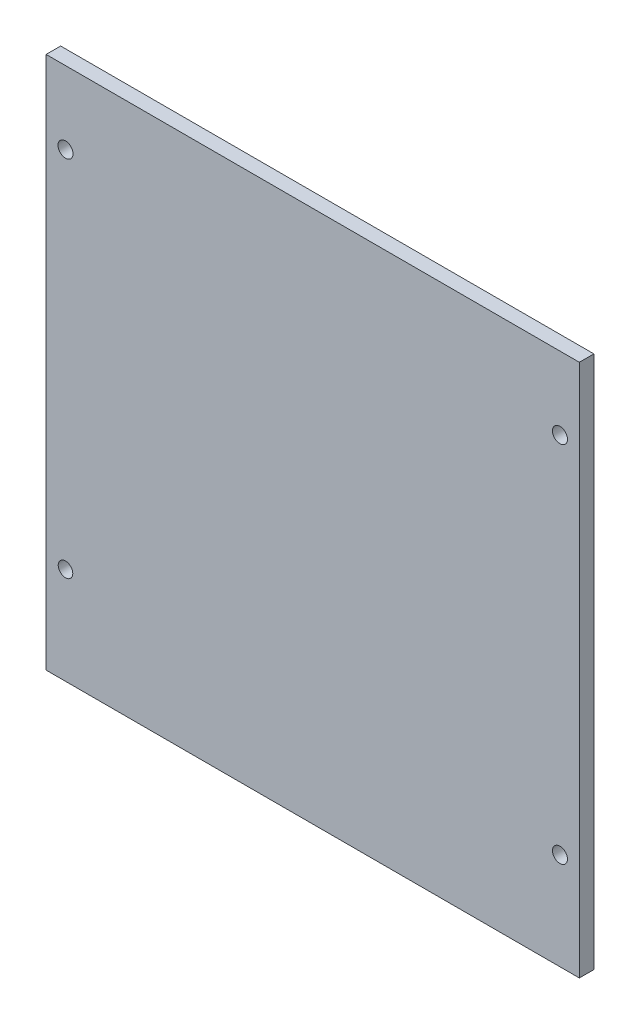
ISO-10303-21;
HEADER;
FILE_DESCRIPTION(('STEP AP214'),'2;1');
FILE_NAME('part.step','',(''),(''),'','','');
FILE_SCHEMA(('AUTOMOTIVE_DESIGN { 1 0 10303 214 1 1 1 1 }'));
ENDSEC;
DATA;
#1=APPLICATION_CONTEXT('core data for automotive mechanical design processes');
#2=APPLICATION_PROTOCOL_DEFINITION('international standard','automotive_design',2000,#1);
#3=PRODUCT_CONTEXT('',#1,'mechanical');
#4=PRODUCT('Part','Part','',(#3));
#5=PRODUCT_RELATED_PRODUCT_CATEGORY('part','',(#4));
#6=PRODUCT_DEFINITION_FORMATION('','',#4);
#7=PRODUCT_DEFINITION_CONTEXT('part definition',#1,'design');
#8=PRODUCT_DEFINITION('design','',#6,#7);
#9=PRODUCT_DEFINITION_SHAPE('','',#8);
#10=(LENGTH_UNIT() NAMED_UNIT(*) SI_UNIT(.MILLI.,.METRE.));
#11=(NAMED_UNIT(*) PLANE_ANGLE_UNIT() SI_UNIT($,.RADIAN.));
#12=(NAMED_UNIT(*) SI_UNIT($,.STERADIAN.) SOLID_ANGLE_UNIT());
#13=UNCERTAINTY_MEASURE_WITH_UNIT(LENGTH_MEASURE(1.E-05),#10,'distance_accuracy_value','');
#14=(GEOMETRIC_REPRESENTATION_CONTEXT(3) GLOBAL_UNCERTAINTY_ASSIGNED_CONTEXT((#13)) GLOBAL_UNIT_ASSIGNED_CONTEXT((#10,
#11,#12)) REPRESENTATION_CONTEXT('',''));
#15=CARTESIAN_POINT('',(0.,0.,0.));
#16=DIRECTION('',(0.,0.,1.));
#17=DIRECTION('',(1.,0.,0.));
#18=AXIS2_PLACEMENT_3D('',#15,#16,#17);
#19=CARTESIAN_POINT('',(-55.,-55.,3.));
#20=DIRECTION('',(1.,0.,0.));
#21=DIRECTION('',(0.,0.,-1.));
#22=AXIS2_PLACEMENT_3D('',#19,#20,#21);
#23=PLANE('',#22);
#24=DIRECTION('',(0.,-1.,0.));
#25=VECTOR('',#24,1.);
#26=CARTESIAN_POINT('',(-55.,-55.,0.));
#27=LINE('',#26,#25);
#28=CARTESIAN_POINT('',(-55.,55.,0.));
#29=VERTEX_POINT('',#28);
#30=CARTESIAN_POINT('',(-55.,-55.,0.));
#31=VERTEX_POINT('',#30);
#32=EDGE_CURVE('E113',#29,#31,#27,.T.);
#33=ORIENTED_EDGE('',*,*,#32,.T.);
#34=DIRECTION('',(0.,0.,-1.));
#35=VECTOR('',#34,1.);
#36=CARTESIAN_POINT('',(-55.,-55.,3.));
#37=LINE('',#36,#35);
#38=CARTESIAN_POINT('',(-55.,-55.,3.));
#39=VERTEX_POINT('',#38);
#40=EDGE_CURVE('E11',#39,#31,#37,.T.);
#41=ORIENTED_EDGE('',*,*,#40,.F.);
#42=DIRECTION('',(0.,-1.,0.));
#43=VECTOR('',#42,1.);
#44=CARTESIAN_POINT('',(-55.,-55.,3.));
#45=LINE('',#44,#43);
#46=CARTESIAN_POINT('',(-55.,55.,3.));
#47=VERTEX_POINT('',#46);
#48=EDGE_CURVE('E96',#47,#39,#45,.T.);
#49=ORIENTED_EDGE('',*,*,#48,.F.);
#50=DIRECTION('',(0.,0.,-1.));
#51=VECTOR('',#50,1.);
#52=CARTESIAN_POINT('',(-55.,55.,3.));
#53=LINE('',#52,#51);
#54=EDGE_CURVE('E109',#47,#29,#53,.T.);
#55=ORIENTED_EDGE('',*,*,#54,.T.);
#56=EDGE_LOOP('',(#33,#41,#49,#55));
#57=FACE_BOUND('',#56,.T.);
#58=ADVANCED_FACE('F42',(#57),#23,.F.);
#59=CARTESIAN_POINT('',(55.,-55.,3.));
#60=DIRECTION('',(0.,1.,0.));
#61=DIRECTION('',(-1.,0.,0.));
#62=AXIS2_PLACEMENT_3D('',#59,#60,#61);
#63=PLANE('',#62);
#64=DIRECTION('',(1.,0.,0.));
#65=VECTOR('',#64,1.);
#66=CARTESIAN_POINT('',(55.,-55.,0.));
#67=LINE('',#66,#65);
#68=CARTESIAN_POINT('',(55.,-55.,0.));
#69=VERTEX_POINT('',#68);
#70=EDGE_CURVE('E101',#31,#69,#67,.T.);
#71=ORIENTED_EDGE('',*,*,#70,.T.);
#72=DIRECTION('',(0.,0.,-1.));
#73=VECTOR('',#72,1.);
#74=CARTESIAN_POINT('',(55.,-55.,3.));
#75=LINE('',#74,#73);
#76=CARTESIAN_POINT('',(55.,-55.,3.));
#77=VERTEX_POINT('',#76);
#78=EDGE_CURVE('E52',#77,#69,#75,.T.);
#79=ORIENTED_EDGE('',*,*,#78,.F.);
#80=DIRECTION('',(1.,0.,0.));
#81=VECTOR('',#80,1.);
#82=CARTESIAN_POINT('',(55.,-55.,3.));
#83=LINE('',#82,#81);
#84=EDGE_CURVE('E91',#39,#77,#83,.T.);
#85=ORIENTED_EDGE('',*,*,#84,.F.);
#86=ORIENTED_EDGE('',*,*,#40,.T.);
#87=EDGE_LOOP('',(#71,#79,#85,#86));
#88=FACE_BOUND('',#87,.T.);
#89=ADVANCED_FACE('F100',(#88),#63,.F.);
#90=CARTESIAN_POINT('',(55.,-55.,3.));
#91=DIRECTION('',(-1.,0.,0.));
#92=DIRECTION('',(0.,0.,1.));
#93=AXIS2_PLACEMENT_3D('',#90,#91,#92);
#94=PLANE('',#93);
#95=DIRECTION('',(0.,1.,0.));
#96=VECTOR('',#95,1.);
#97=CARTESIAN_POINT('',(55.,-55.,0.));
#98=LINE('',#97,#96);
#99=CARTESIAN_POINT('',(55.,55.,0.));
#100=VERTEX_POINT('',#99);
#101=EDGE_CURVE('E78',#69,#100,#98,.T.);
#102=ORIENTED_EDGE('',*,*,#101,.T.);
#103=DIRECTION('',(0.,0.,-1.));
#104=VECTOR('',#103,1.);
#105=CARTESIAN_POINT('',(55.,55.,3.));
#106=LINE('',#105,#104);
#107=CARTESIAN_POINT('',(55.,55.,3.));
#108=VERTEX_POINT('',#107);
#109=EDGE_CURVE('E103',#108,#100,#106,.T.);
#110=ORIENTED_EDGE('',*,*,#109,.F.);
#111=DIRECTION('',(0.,1.,0.));
#112=VECTOR('',#111,1.);
#113=CARTESIAN_POINT('',(55.,-55.,3.));
#114=LINE('',#113,#112);
#115=EDGE_CURVE('E94',#77,#108,#114,.T.);
#116=ORIENTED_EDGE('',*,*,#115,.F.);
#117=ORIENTED_EDGE('',*,*,#78,.T.);
#118=EDGE_LOOP('',(#102,#110,#116,#117));
#119=FACE_BOUND('',#118,.T.);
#120=ADVANCED_FACE('F105',(#119),#94,.F.);
#121=CARTESIAN_POINT('',(55.,55.,3.));
#122=DIRECTION('',(0.,-1.,0.));
#123=DIRECTION('',(1.,0.,0.));
#124=AXIS2_PLACEMENT_3D('',#121,#122,#123);
#125=PLANE('',#124);
#126=DIRECTION('',(-1.,0.,0.));
#127=VECTOR('',#126,1.);
#128=CARTESIAN_POINT('',(55.,55.,0.));
#129=LINE('',#128,#127);
#130=EDGE_CURVE('E84',#100,#29,#129,.T.);
#131=ORIENTED_EDGE('',*,*,#130,.T.);
#132=ORIENTED_EDGE('',*,*,#54,.F.);
#133=DIRECTION('',(-1.,0.,0.));
#134=VECTOR('',#133,1.);
#135=CARTESIAN_POINT('',(55.,55.,3.));
#136=LINE('',#135,#134);
#137=EDGE_CURVE('E61',#108,#47,#136,.T.);
#138=ORIENTED_EDGE('',*,*,#137,.F.);
#139=ORIENTED_EDGE('',*,*,#109,.T.);
#140=EDGE_LOOP('',(#131,#132,#138,#139));
#141=FACE_BOUND('',#140,.T.);
#142=ADVANCED_FACE('F176',(#141),#125,.F.);
#143=CARTESIAN_POINT('',(0.,0.,3.));
#144=DIRECTION('',(0.,0.,1.));
#145=DIRECTION('',(1.,0.,0.));
#146=AXIS2_PLACEMENT_3D('',#143,#144,#145);
#147=PLANE('',#146);
#148=CARTESIAN_POINT('',(51.,-35.,3.));
#149=DIRECTION('',(0.,0.,1.));
#150=DIRECTION('',(1.,0.,0.));
#151=AXIS2_PLACEMENT_3D('',#148,#149,#150);
#152=CIRCLE('',#151,1.55);
#153=CARTESIAN_POINT('',(52.55,-35.,3.));
#154=VERTEX_POINT('',#153);
#155=EDGE_CURVE('E273',#154,#154,#152,.T.);
#156=ORIENTED_EDGE('',*,*,#155,.F.);
#157=EDGE_LOOP('',(#156));
#158=FACE_BOUND('',#157,.T.);
#159=CARTESIAN_POINT('',(-51.,40.,3.));
#160=DIRECTION('',(0.,0.,1.));
#161=DIRECTION('',(1.,0.,0.));
#162=AXIS2_PLACEMENT_3D('',#159,#160,#161);
#163=CIRCLE('',#162,1.55);
#164=CARTESIAN_POINT('',(-49.45,40.,3.));
#165=VERTEX_POINT('',#164);
#166=EDGE_CURVE('E269',#165,#165,#163,.T.);
#167=ORIENTED_EDGE('',*,*,#166,.F.);
#168=EDGE_LOOP('',(#167));
#169=FACE_BOUND('',#168,.T.);
#170=CARTESIAN_POINT('',(-51.,-35.,3.));
#171=DIRECTION('',(0.,0.,1.));
#172=DIRECTION('',(1.,0.,0.));
#173=AXIS2_PLACEMENT_3D('',#170,#171,#172);
#174=CIRCLE('',#173,1.5);
#175=CARTESIAN_POINT('',(-49.5,-35.,3.));
#176=VERTEX_POINT('',#175);
#177=EDGE_CURVE('E261',#176,#176,#174,.T.);
#178=ORIENTED_EDGE('',*,*,#177,.F.);
#179=EDGE_LOOP('',(#178));
#180=FACE_BOUND('',#179,.T.);
#181=CARTESIAN_POINT('',(51.,40.,3.));
#182=DIRECTION('',(0.,0.,1.));
#183=DIRECTION('',(1.,0.,0.));
#184=AXIS2_PLACEMENT_3D('',#181,#182,#183);
#185=CIRCLE('',#184,1.54999999999999);
#186=CARTESIAN_POINT('',(52.55,40.,3.));
#187=VERTEX_POINT('',#186);
#188=EDGE_CURVE('E132',#187,#187,#185,.T.);
#189=ORIENTED_EDGE('',*,*,#188,.F.);
#190=EDGE_LOOP('',(#189));
#191=FACE_BOUND('',#190,.T.);
#192=ORIENTED_EDGE('',*,*,#48,.T.);
#193=ORIENTED_EDGE('',*,*,#84,.T.);
#194=ORIENTED_EDGE('',*,*,#115,.T.);
#195=ORIENTED_EDGE('',*,*,#137,.T.);
#196=EDGE_LOOP('',(#192,#193,#194,#195));
#197=FACE_BOUND('',#196,.T.);
#198=ADVANCED_FACE('F92',(#158,#169,#180,#191,#197),#147,.T.);
#199=CARTESIAN_POINT('',(0.,0.,0.));
#200=DIRECTION('',(0.,0.,1.));
#201=DIRECTION('',(1.,0.,0.));
#202=AXIS2_PLACEMENT_3D('',#199,#200,#201);
#203=PLANE('',#202);
#204=CARTESIAN_POINT('',(51.,-35.,0.));
#205=DIRECTION('',(0.,0.,1.));
#206=DIRECTION('',(1.,0.,0.));
#207=AXIS2_PLACEMENT_3D('',#204,#205,#206);
#208=CIRCLE('',#207,1.55);
#209=CARTESIAN_POINT('',(52.55,-35.,0.));
#210=VERTEX_POINT('',#209);
#211=EDGE_CURVE('E45',#210,#210,#208,.T.);
#212=ORIENTED_EDGE('',*,*,#211,.T.);
#213=EDGE_LOOP('',(#212));
#214=FACE_BOUND('',#213,.T.);
#215=CARTESIAN_POINT('',(-51.,40.,0.));
#216=DIRECTION('',(0.,0.,1.));
#217=DIRECTION('',(1.,0.,0.));
#218=AXIS2_PLACEMENT_3D('',#215,#216,#217);
#219=CIRCLE('',#218,1.55);
#220=CARTESIAN_POINT('',(-49.45,40.,0.));
#221=VERTEX_POINT('',#220);
#222=EDGE_CURVE('E135',#221,#221,#219,.T.);
#223=ORIENTED_EDGE('',*,*,#222,.T.);
#224=EDGE_LOOP('',(#223));
#225=FACE_BOUND('',#224,.T.);
#226=CARTESIAN_POINT('',(-51.,-35.,0.));
#227=DIRECTION('',(0.,0.,1.));
#228=DIRECTION('',(1.,0.,0.));
#229=AXIS2_PLACEMENT_3D('',#226,#227,#228);
#230=CIRCLE('',#229,1.5);
#231=CARTESIAN_POINT('',(-49.5,-35.,0.));
#232=VERTEX_POINT('',#231);
#233=EDGE_CURVE('E131',#232,#232,#230,.T.);
#234=ORIENTED_EDGE('',*,*,#233,.T.);
#235=EDGE_LOOP('',(#234));
#236=FACE_BOUND('',#235,.T.);
#237=CARTESIAN_POINT('',(51.,40.,0.));
#238=DIRECTION('',(0.,0.,1.));
#239=DIRECTION('',(1.,0.,0.));
#240=AXIS2_PLACEMENT_3D('',#237,#238,#239);
#241=CIRCLE('',#240,1.54999999999999);
#242=CARTESIAN_POINT('',(52.55,40.,0.));
#243=VERTEX_POINT('',#242);
#244=EDGE_CURVE('E127',#243,#243,#241,.T.);
#245=ORIENTED_EDGE('',*,*,#244,.T.);
#246=EDGE_LOOP('',(#245));
#247=FACE_BOUND('',#246,.T.);
#248=ORIENTED_EDGE('',*,*,#32,.F.);
#249=ORIENTED_EDGE('',*,*,#130,.F.);
#250=ORIENTED_EDGE('',*,*,#101,.F.);
#251=ORIENTED_EDGE('',*,*,#70,.F.);
#252=EDGE_LOOP('',(#248,#249,#250,#251));
#253=FACE_BOUND('',#252,.T.);
#254=ADVANCED_FACE('F144',(#214,#225,#236,#247,#253),#203,.F.);
#255=CARTESIAN_POINT('',(51.,40.,-7.));
#256=DIRECTION('',(0.,0.,1.));
#257=DIRECTION('',(1.,0.,0.));
#258=AXIS2_PLACEMENT_3D('',#255,#256,#257);
#259=CYLINDRICAL_SURFACE('',#258,1.54999999999999);
#260=ORIENTED_EDGE('',*,*,#188,.T.);
#261=EDGE_LOOP('',(#260));
#262=FACE_BOUND('',#261,.T.);
#263=ORIENTED_EDGE('',*,*,#244,.F.);
#264=EDGE_LOOP('',(#263));
#265=FACE_BOUND('',#264,.T.);
#266=ADVANCED_FACE('F167',(#262,#265),#259,.F.);
#267=CARTESIAN_POINT('',(-51.,-35.,-7.));
#268=DIRECTION('',(0.,0.,1.));
#269=DIRECTION('',(1.,0.,0.));
#270=AXIS2_PLACEMENT_3D('',#267,#268,#269);
#271=CYLINDRICAL_SURFACE('',#270,1.5);
#272=ORIENTED_EDGE('',*,*,#177,.T.);
#273=EDGE_LOOP('',(#272));
#274=FACE_BOUND('',#273,.T.);
#275=ORIENTED_EDGE('',*,*,#233,.F.);
#276=EDGE_LOOP('',(#275));
#277=FACE_BOUND('',#276,.T.);
#278=ADVANCED_FACE('F154',(#274,#277),#271,.F.);
#279=CARTESIAN_POINT('',(-51.,40.,-7.));
#280=DIRECTION('',(0.,0.,1.));
#281=DIRECTION('',(1.,0.,0.));
#282=AXIS2_PLACEMENT_3D('',#279,#280,#281);
#283=CYLINDRICAL_SURFACE('',#282,1.55);
#284=ORIENTED_EDGE('',*,*,#166,.T.);
#285=EDGE_LOOP('',(#284));
#286=FACE_BOUND('',#285,.T.);
#287=ORIENTED_EDGE('',*,*,#222,.F.);
#288=EDGE_LOOP('',(#287));
#289=FACE_BOUND('',#288,.T.);
#290=ADVANCED_FACE('F148',(#286,#289),#283,.F.);
#291=CARTESIAN_POINT('',(51.,-35.,-7.));
#292=DIRECTION('',(0.,0.,1.));
#293=DIRECTION('',(1.,0.,0.));
#294=AXIS2_PLACEMENT_3D('',#291,#292,#293);
#295=CYLINDRICAL_SURFACE('',#294,1.55);
#296=ORIENTED_EDGE('',*,*,#155,.T.);
#297=EDGE_LOOP('',(#296));
#298=FACE_BOUND('',#297,.T.);
#299=ORIENTED_EDGE('',*,*,#211,.F.);
#300=EDGE_LOOP('',(#299));
#301=FACE_BOUND('',#300,.T.);
#302=ADVANCED_FACE('F146',(#298,#301),#295,.F.);
#303=CLOSED_SHELL('',(#58,#89,#120,#142,#198,#254,#266,#278,#290,#302));
#304=MANIFOLD_SOLID_BREP('B2',#303);
#305=ADVANCED_BREP_SHAPE_REPRESENTATION('',(#18,#304),#14);
#306=SHAPE_DEFINITION_REPRESENTATION(#9,#305);
ENDSEC;
END-ISO-10303-21;
